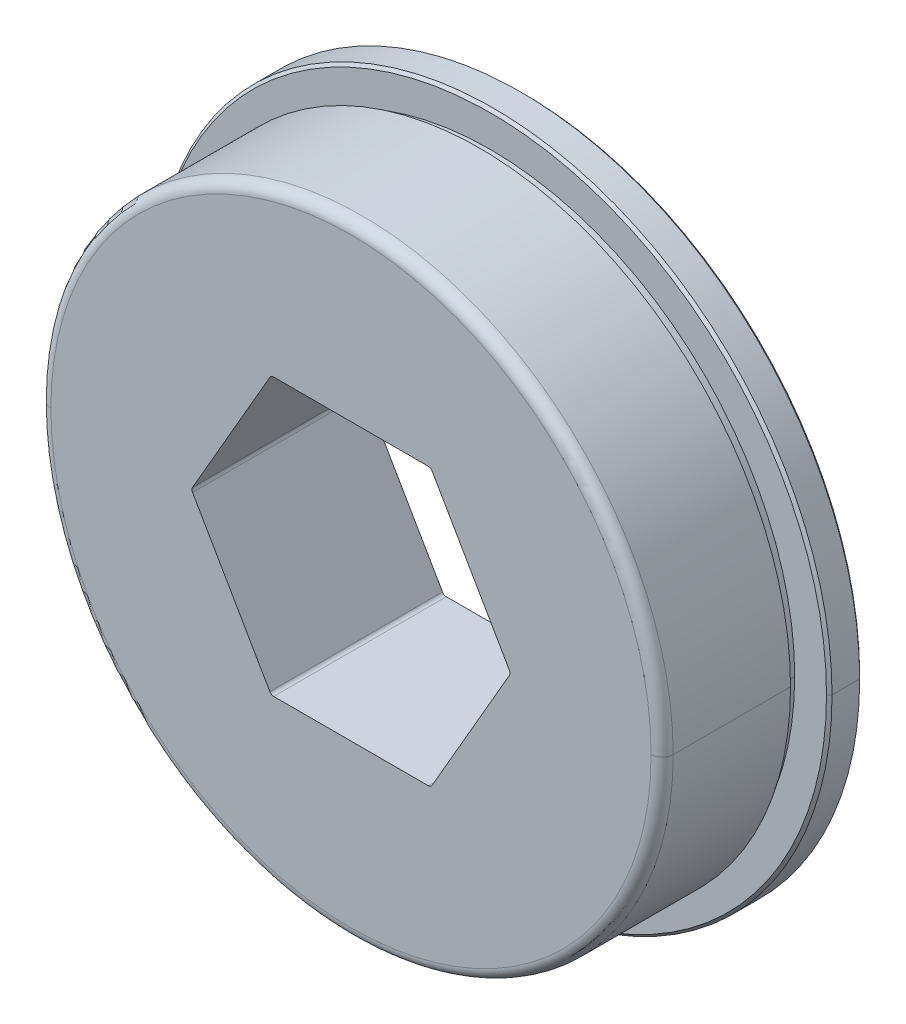
ISO-10303-21;
HEADER;
FILE_DESCRIPTION(('STEP AP214'),'2;1');
FILE_NAME('part.step','',(''),(''),'','','');
FILE_SCHEMA(('AUTOMOTIVE_DESIGN { 1 0 10303 214 1 1 1 1 }'));
ENDSEC;
DATA;
#1=APPLICATION_CONTEXT('core data for automotive mechanical design processes');
#2=APPLICATION_PROTOCOL_DEFINITION('international standard','automotive_design',2000,#1);
#3=PRODUCT_CONTEXT('',#1,'mechanical');
#4=PRODUCT('Part','Part','',(#3));
#5=PRODUCT_RELATED_PRODUCT_CATEGORY('part','',(#4));
#6=PRODUCT_DEFINITION_FORMATION('','',#4);
#7=PRODUCT_DEFINITION_CONTEXT('part definition',#1,'design');
#8=PRODUCT_DEFINITION('design','',#6,#7);
#9=PRODUCT_DEFINITION_SHAPE('','',#8);
#10=(LENGTH_UNIT() NAMED_UNIT(*) SI_UNIT(.MILLI.,.METRE.));
#11=(NAMED_UNIT(*) PLANE_ANGLE_UNIT() SI_UNIT($,.RADIAN.));
#12=(NAMED_UNIT(*) SI_UNIT($,.STERADIAN.) SOLID_ANGLE_UNIT());
#13=UNCERTAINTY_MEASURE_WITH_UNIT(LENGTH_MEASURE(1.E-05),#10,'distance_accuracy_value','');
#14=(GEOMETRIC_REPRESENTATION_CONTEXT(3) GLOBAL_UNCERTAINTY_ASSIGNED_CONTEXT((#13)) GLOBAL_UNIT_ASSIGNED_CONTEXT((#10,
#11,#12)) REPRESENTATION_CONTEXT('',''));
#15=CARTESIAN_POINT('',(0.,0.,0.));
#16=DIRECTION('',(0.,0.,1.));
#17=DIRECTION('',(1.,0.,0.));
#18=AXIS2_PLACEMENT_3D('',#15,#16,#17);
#19=CARTESIAN_POINT('',(-3.54885663465478,6.1468,-7.92734));
#20=DIRECTION('',(0.,0.,-1.));
#21=DIRECTION('',(1.,0.,0.));
#22=AXIS2_PLACEMENT_3D('',#19,#20,#21);
#23=CYLINDRICAL_SURFACE('',#22,0.2032);
#24=CARTESIAN_POINT('',(-3.54885663465478,6.1468,-7.92734));
#25=DIRECTION('',(0.,0.,-1.));
#26=DIRECTION('',(1.,0.,0.));
#27=AXIS2_PLACEMENT_3D('',#24,#25,#26);
#28=CIRCLE('',#27,0.2032);
#29=CARTESIAN_POINT('',(-3.72483299670378,6.2484,-7.92734));
#30=VERTEX_POINT('',#29);
#31=CARTESIAN_POINT('',(-3.54885663465478,6.35,-7.92734));
#32=VERTEX_POINT('',#31);
#33=EDGE_CURVE('E282',#30,#32,#28,.T.);
#34=ORIENTED_EDGE('',*,*,#33,.T.);
#35=DIRECTION('',(0.,0.,1.));
#36=VECTOR('',#35,1.);
#37=CARTESIAN_POINT('',(-3.54885663465478,6.35,0.));
#38=LINE('',#37,#36);
#39=CARTESIAN_POINT('',(-3.54885663465478,6.35,0.));
#40=VERTEX_POINT('',#39);
#41=EDGE_CURVE('E11',#32,#40,#38,.T.);
#42=ORIENTED_EDGE('',*,*,#41,.T.);
#43=CARTESIAN_POINT('',(-3.54885663465478,6.1468,0.));
#44=DIRECTION('',(0.,0.,1.));
#45=DIRECTION('',(-1.,0.,0.));
#46=AXIS2_PLACEMENT_3D('',#43,#44,#45);
#47=CIRCLE('',#46,0.2032);
#48=CARTESIAN_POINT('',(-3.72483299670378,6.2484,0.));
#49=VERTEX_POINT('',#48);
#50=EDGE_CURVE('E257',#40,#49,#47,.T.);
#51=ORIENTED_EDGE('',*,*,#50,.T.);
#52=DIRECTION('',(0.,0.,-1.));
#53=VECTOR('',#52,1.);
#54=CARTESIAN_POINT('',(-3.72483299670378,6.2484,-7.92734));
#55=LINE('',#54,#53);
#56=EDGE_CURVE('E407',#49,#30,#55,.T.);
#57=ORIENTED_EDGE('',*,*,#56,.T.);
#58=EDGE_LOOP('',(#34,#42,#51,#57));
#59=FACE_BOUND('',#58,.T.);
#60=ADVANCED_FACE('F46',(#59),#23,.F.);
#61=CARTESIAN_POINT('',(-7.09771326930958,0.,-7.92734));
#62=DIRECTION('',(0.,0.,-1.));
#63=DIRECTION('',(1.,0.,0.));
#64=AXIS2_PLACEMENT_3D('',#61,#62,#63);
#65=CYLINDRICAL_SURFACE('',#64,0.2032);
#66=CARTESIAN_POINT('',(-7.09771326930958,0.,-7.92734));
#67=DIRECTION('',(0.,0.,-1.));
#68=DIRECTION('',(1.,0.,0.));
#69=AXIS2_PLACEMENT_3D('',#66,#67,#68);
#70=CIRCLE('',#69,0.2032);
#71=CARTESIAN_POINT('',(-7.27368963135857,-0.101600000000006,-7.92734));
#72=VERTEX_POINT('',#71);
#73=CARTESIAN_POINT('',(-7.27368963135857,0.101599999999993,-7.92734));
#74=VERTEX_POINT('',#73);
#75=EDGE_CURVE('E283',#72,#74,#70,.T.);
#76=ORIENTED_EDGE('',*,*,#75,.T.);
#77=DIRECTION('',(0.,0.,1.));
#78=VECTOR('',#77,1.);
#79=CARTESIAN_POINT('',(-7.27368963135857,0.101599999999994,0.));
#80=LINE('',#79,#78);
#81=CARTESIAN_POINT('',(-7.27368963135857,0.101599999999993,0.));
#82=VERTEX_POINT('',#81);
#83=EDGE_CURVE('E412',#74,#82,#80,.T.);
#84=ORIENTED_EDGE('',*,*,#83,.T.);
#85=CARTESIAN_POINT('',(-7.09771326930958,0.,0.));
#86=DIRECTION('',(0.,0.,1.));
#87=DIRECTION('',(-1.,0.,0.));
#88=AXIS2_PLACEMENT_3D('',#85,#86,#87);
#89=CIRCLE('',#88,0.2032);
#90=CARTESIAN_POINT('',(-7.27368963135857,-0.101600000000006,0.));
#91=VERTEX_POINT('',#90);
#92=EDGE_CURVE('E287',#82,#91,#89,.T.);
#93=ORIENTED_EDGE('',*,*,#92,.T.);
#94=DIRECTION('',(0.,0.,-1.));
#95=VECTOR('',#94,1.);
#96=CARTESIAN_POINT('',(-7.27368963135857,-0.101600000000006,-7.92734));
#97=LINE('',#96,#95);
#98=EDGE_CURVE('E457',#91,#72,#97,.T.);
#99=ORIENTED_EDGE('',*,*,#98,.T.);
#100=EDGE_LOOP('',(#76,#84,#93,#99));
#101=FACE_BOUND('',#100,.T.);
#102=ADVANCED_FACE('F511',(#101),#65,.F.);
#103=CARTESIAN_POINT('',(-3.54885663465478,-6.1468,-7.92734));
#104=DIRECTION('',(0.,0.,-1.));
#105=DIRECTION('',(1.,0.,0.));
#106=AXIS2_PLACEMENT_3D('',#103,#104,#105);
#107=CYLINDRICAL_SURFACE('',#106,0.2032);
#108=CARTESIAN_POINT('',(-3.54885663465478,-6.1468,-7.92734));
#109=DIRECTION('',(0.,0.,-1.));
#110=DIRECTION('',(1.,0.,0.));
#111=AXIS2_PLACEMENT_3D('',#108,#109,#110);
#112=CIRCLE('',#111,0.2032);
#113=CARTESIAN_POINT('',(-3.54885663465478,-6.35,-7.92734));
#114=VERTEX_POINT('',#113);
#115=CARTESIAN_POINT('',(-3.72483299670378,-6.2484,-7.92734));
#116=VERTEX_POINT('',#115);
#117=EDGE_CURVE('E361',#114,#116,#112,.T.);
#118=ORIENTED_EDGE('',*,*,#117,.T.);
#119=DIRECTION('',(0.,0.,1.));
#120=VECTOR('',#119,1.);
#121=CARTESIAN_POINT('',(-3.72483299670378,-6.2484,0.));
#122=LINE('',#121,#120);
#123=CARTESIAN_POINT('',(-3.72483299670378,-6.2484,0.));
#124=VERTEX_POINT('',#123);
#125=EDGE_CURVE('E411',#116,#124,#122,.T.);
#126=ORIENTED_EDGE('',*,*,#125,.T.);
#127=CARTESIAN_POINT('',(-3.54885663465478,-6.1468,0.));
#128=DIRECTION('',(0.,0.,1.));
#129=DIRECTION('',(-1.,0.,0.));
#130=AXIS2_PLACEMENT_3D('',#127,#128,#129);
#131=CIRCLE('',#130,0.2032);
#132=CARTESIAN_POINT('',(-3.54885663465478,-6.35,0.));
#133=VERTEX_POINT('',#132);
#134=EDGE_CURVE('E272',#124,#133,#131,.T.);
#135=ORIENTED_EDGE('',*,*,#134,.T.);
#136=DIRECTION('',(0.,0.,-1.));
#137=VECTOR('',#136,1.);
#138=CARTESIAN_POINT('',(-3.54885663465478,-6.35,-7.92734));
#139=LINE('',#138,#137);
#140=EDGE_CURVE('E312',#133,#114,#139,.T.);
#141=ORIENTED_EDGE('',*,*,#140,.T.);
#142=EDGE_LOOP('',(#118,#126,#135,#141));
#143=FACE_BOUND('',#142,.T.);
#144=ADVANCED_FACE('F517',(#143),#107,.F.);
#145=CARTESIAN_POINT('',(3.5488566346548,-6.1468,-7.92734));
#146=DIRECTION('',(0.,0.,-1.));
#147=DIRECTION('',(1.,0.,0.));
#148=AXIS2_PLACEMENT_3D('',#145,#146,#147);
#149=CYLINDRICAL_SURFACE('',#148,0.2032);
#150=CARTESIAN_POINT('',(3.5488566346548,-6.1468,-7.92734));
#151=DIRECTION('',(0.,0.,-1.));
#152=DIRECTION('',(1.,0.,0.));
#153=AXIS2_PLACEMENT_3D('',#150,#151,#152);
#154=CIRCLE('',#153,0.2032);
#155=CARTESIAN_POINT('',(3.7248329967038,-6.2484,-7.92734));
#156=VERTEX_POINT('',#155);
#157=CARTESIAN_POINT('',(3.5488566346548,-6.35,-7.92734));
#158=VERTEX_POINT('',#157);
#159=EDGE_CURVE('E50',#156,#158,#154,.T.);
#160=ORIENTED_EDGE('',*,*,#159,.T.);
#161=DIRECTION('',(0.,0.,1.));
#162=VECTOR('',#161,1.);
#163=CARTESIAN_POINT('',(3.5488566346548,-6.35,0.));
#164=LINE('',#163,#162);
#165=CARTESIAN_POINT('',(3.5488566346548,-6.35,0.));
#166=VERTEX_POINT('',#165);
#167=EDGE_CURVE('E453',#158,#166,#164,.T.);
#168=ORIENTED_EDGE('',*,*,#167,.T.);
#169=CARTESIAN_POINT('',(3.5488566346548,-6.1468,0.));
#170=DIRECTION('',(0.,0.,1.));
#171=DIRECTION('',(-1.,0.,0.));
#172=AXIS2_PLACEMENT_3D('',#169,#170,#171);
#173=CIRCLE('',#172,0.2032);
#174=CARTESIAN_POINT('',(3.7248329967038,-6.2484,0.));
#175=VERTEX_POINT('',#174);
#176=EDGE_CURVE('E390',#166,#175,#173,.T.);
#177=ORIENTED_EDGE('',*,*,#176,.T.);
#178=DIRECTION('',(0.,0.,-1.));
#179=VECTOR('',#178,1.);
#180=CARTESIAN_POINT('',(3.7248329967038,-6.2484,-7.92734));
#181=LINE('',#180,#179);
#182=EDGE_CURVE('E311',#175,#156,#181,.T.);
#183=ORIENTED_EDGE('',*,*,#182,.T.);
#184=EDGE_LOOP('',(#160,#168,#177,#183));
#185=FACE_BOUND('',#184,.T.);
#186=ADVANCED_FACE('F548',(#185),#149,.F.);
#187=CARTESIAN_POINT('',(7.09771326930959,0.,-7.92734));
#188=DIRECTION('',(0.,0.,-1.));
#189=DIRECTION('',(1.,0.,0.));
#190=AXIS2_PLACEMENT_3D('',#187,#188,#189);
#191=CYLINDRICAL_SURFACE('',#190,0.2032);
#192=DIRECTION('',(0.,0.,-1.));
#193=VECTOR('',#192,1.);
#194=CARTESIAN_POINT('',(7.30091326930959,0.,-7.92734));
#195=LINE('',#194,#193);
#196=CARTESIAN_POINT('',(7.30091326930959,0.,0.));
#197=VERTEX_POINT('',#196);
#198=CARTESIAN_POINT('',(7.30091326930959,0.,-7.92734));
#199=VERTEX_POINT('',#198);
#200=EDGE_CURVE('E366',#197,#199,#195,.T.);
#201=ORIENTED_EDGE('',*,*,#200,.T.);
#202=CARTESIAN_POINT('',(7.09771326930959,0.,-7.92734));
#203=DIRECTION('',(0.,0.,-1.));
#204=DIRECTION('',(1.,0.,0.));
#205=AXIS2_PLACEMENT_3D('',#202,#203,#204);
#206=CIRCLE('',#205,0.2032);
#207=CARTESIAN_POINT('',(7.27368963135859,-0.101600000000005,-7.92734));
#208=VERTEX_POINT('',#207);
#209=EDGE_CURVE('E397',#199,#208,#206,.T.);
#210=ORIENTED_EDGE('',*,*,#209,.T.);
#211=DIRECTION('',(0.,0.,1.));
#212=VECTOR('',#211,1.);
#213=CARTESIAN_POINT('',(7.27368963135859,-0.101600000000005,0.));
#214=LINE('',#213,#212);
#215=CARTESIAN_POINT('',(7.27368963135859,-0.101600000000005,0.));
#216=VERTEX_POINT('',#215);
#217=EDGE_CURVE('E307',#208,#216,#214,.T.);
#218=ORIENTED_EDGE('',*,*,#217,.T.);
#219=CARTESIAN_POINT('',(7.09771326930959,0.,0.));
#220=DIRECTION('',(0.,0.,1.));
#221=DIRECTION('',(-1.,0.,0.));
#222=AXIS2_PLACEMENT_3D('',#219,#220,#221);
#223=CIRCLE('',#222,0.2032);
#224=EDGE_CURVE('E299',#216,#197,#223,.T.);
#225=ORIENTED_EDGE('',*,*,#224,.T.);
#226=EDGE_LOOP('',(#201,#210,#218,#225));
#227=FACE_BOUND('',#226,.T.);
#228=ADVANCED_FACE('F774',(#227),#191,.F.);
#229=CARTESIAN_POINT('',(3.5488566346548,6.1468,-7.92734));
#230=DIRECTION('',(0.,0.,-1.));
#231=DIRECTION('',(1.,0.,0.));
#232=AXIS2_PLACEMENT_3D('',#229,#230,#231);
#233=CYLINDRICAL_SURFACE('',#232,0.2032);
#234=CARTESIAN_POINT('',(3.5488566346548,6.1468,-7.92734));
#235=DIRECTION('',(0.,0.,-1.));
#236=DIRECTION('',(1.,0.,0.));
#237=AXIS2_PLACEMENT_3D('',#234,#235,#236);
#238=CIRCLE('',#237,0.2032);
#239=CARTESIAN_POINT('',(3.5488566346548,6.35,-7.92734));
#240=VERTEX_POINT('',#239);
#241=CARTESIAN_POINT('',(3.7248329967038,6.2484,-7.92734));
#242=VERTEX_POINT('',#241);
#243=EDGE_CURVE('E352',#240,#242,#238,.T.);
#244=ORIENTED_EDGE('',*,*,#243,.T.);
#245=DIRECTION('',(0.,0.,1.));
#246=VECTOR('',#245,1.);
#247=CARTESIAN_POINT('',(3.7248329967038,6.2484,0.));
#248=LINE('',#247,#246);
#249=CARTESIAN_POINT('',(3.7248329967038,6.2484,0.));
#250=VERTEX_POINT('',#249);
#251=EDGE_CURVE('E450',#242,#250,#248,.T.);
#252=ORIENTED_EDGE('',*,*,#251,.T.);
#253=CARTESIAN_POINT('',(3.5488566346548,6.1468,0.));
#254=DIRECTION('',(0.,0.,1.));
#255=DIRECTION('',(-1.,0.,0.));
#256=AXIS2_PLACEMENT_3D('',#253,#254,#255);
#257=CIRCLE('',#256,0.2032);
#258=CARTESIAN_POINT('',(3.5488566346548,6.35,0.));
#259=VERTEX_POINT('',#258);
#260=EDGE_CURVE('E288',#250,#259,#257,.T.);
#261=ORIENTED_EDGE('',*,*,#260,.T.);
#262=DIRECTION('',(0.,0.,-1.));
#263=VECTOR('',#262,1.);
#264=CARTESIAN_POINT('',(3.5488566346548,6.35,-7.92734));
#265=LINE('',#264,#263);
#266=EDGE_CURVE('E57',#259,#240,#265,.T.);
#267=ORIENTED_EDGE('',*,*,#266,.T.);
#268=EDGE_LOOP('',(#244,#252,#261,#267));
#269=FACE_BOUND('',#268,.T.);
#270=ADVANCED_FACE('F611',(#269),#233,.F.);
#271=CARTESIAN_POINT('',(0.,0.,-0.508));
#272=DIRECTION('',(0.,0.,1.));
#273=DIRECTION('',(-1.,0.,0.));
#274=AXIS2_PLACEMENT_3D('',#271,#272,#273);
#275=TOROIDAL_SURFACE('',#274,13.7795,0.508);
#276=CARTESIAN_POINT('',(13.7795,0.,-0.508));
#277=DIRECTION('',(0.,-1.,0.));
#278=DIRECTION('',(-1.,0.,0.));
#279=AXIS2_PLACEMENT_3D('',#276,#277,#278);
#280=CIRCLE('',#279,0.508);
#281=CARTESIAN_POINT('',(14.2875,0.,-0.508));
#282=VERTEX_POINT('',#281);
#283=CARTESIAN_POINT('',(13.7795,0.,0.));
#284=VERTEX_POINT('',#283);
#285=EDGE_CURVE('E387',#282,#284,#280,.T.);
#286=ORIENTED_EDGE('',*,*,#285,.T.);
#287=CARTESIAN_POINT('',(0.,0.,0.));
#288=DIRECTION('',(0.,0.,-1.));
#289=DIRECTION('',(-1.,0.,0.));
#290=AXIS2_PLACEMENT_3D('',#287,#288,#289);
#291=CIRCLE('',#290,13.7795);
#292=CARTESIAN_POINT('',(-13.7795,0.,0.));
#293=VERTEX_POINT('',#292);
#294=EDGE_CURVE('E425',#284,#293,#291,.T.);
#295=ORIENTED_EDGE('',*,*,#294,.T.);
#296=CARTESIAN_POINT('',(-13.7795,0.,-0.508));
#297=DIRECTION('',(0.,1.,0.));
#298=DIRECTION('',(0.,0.,1.));
#299=AXIS2_PLACEMENT_3D('',#296,#297,#298);
#300=CIRCLE('',#299,0.508);
#301=CARTESIAN_POINT('',(-14.2875,0.,-0.508));
#302=VERTEX_POINT('',#301);
#303=EDGE_CURVE('E293',#302,#293,#300,.T.);
#304=ORIENTED_EDGE('',*,*,#303,.F.);
#305=CARTESIAN_POINT('',(0.,0.,-0.508));
#306=DIRECTION('',(0.,0.,1.));
#307=DIRECTION('',(-1.,0.,0.));
#308=AXIS2_PLACEMENT_3D('',#305,#306,#307);
#309=CIRCLE('',#308,14.2875);
#310=EDGE_CURVE('E256',#302,#282,#309,.T.);
#311=ORIENTED_EDGE('',*,*,#310,.T.);
#312=EDGE_LOOP('',(#286,#295,#304,#311));
#313=FACE_BOUND('',#312,.T.);
#314=ADVANCED_FACE('F492',(#313),#275,.T.);
#315=CARTESIAN_POINT('',(0.,0.,-7.80034));
#316=DIRECTION('',(0.,0.,1.));
#317=DIRECTION('',(-1.,0.,0.));
#318=AXIS2_PLACEMENT_3D('',#315,#316,#317);
#319=CONICAL_SURFACE('',#318,15.5575,0.785398163397442);
#320=DIRECTION('',(0.707106781186543,0.,0.707106781186552));
#321=VECTOR('',#320,1.);
#322=CARTESIAN_POINT('',(15.5575,0.,-7.80034));
#323=LINE('',#322,#321);
#324=CARTESIAN_POINT('',(15.4305,0.,-7.92734));
#325=VERTEX_POINT('',#324);
#326=CARTESIAN_POINT('',(15.5575,0.,-7.80034));
#327=VERTEX_POINT('',#326);
#328=EDGE_CURVE('E371',#325,#327,#323,.T.);
#329=ORIENTED_EDGE('',*,*,#328,.T.);
#330=CARTESIAN_POINT('',(0.,0.,-7.80034));
#331=DIRECTION('',(0.,0.,-1.));
#332=DIRECTION('',(1.,0.,0.));
#333=AXIS2_PLACEMENT_3D('',#330,#331,#332);
#334=CIRCLE('',#333,15.5575);
#335=CARTESIAN_POINT('',(-15.5575,0.,-7.80034));
#336=VERTEX_POINT('',#335);
#337=EDGE_CURVE('E348',#327,#336,#334,.T.);
#338=ORIENTED_EDGE('',*,*,#337,.T.);
#339=DIRECTION('',(-0.707106781186543,0.,0.707106781186552));
#340=VECTOR('',#339,1.);
#341=CARTESIAN_POINT('',(-15.5575,0.,-7.80034));
#342=LINE('',#341,#340);
#343=CARTESIAN_POINT('',(-15.4305,0.,-7.92734));
#344=VERTEX_POINT('',#343);
#345=EDGE_CURVE('E370',#344,#336,#342,.T.);
#346=ORIENTED_EDGE('',*,*,#345,.F.);
#347=CARTESIAN_POINT('',(0.,0.,-7.92734));
#348=DIRECTION('',(0.,0.,1.));
#349=DIRECTION('',(1.,0.,0.));
#350=AXIS2_PLACEMENT_3D('',#347,#348,#349);
#351=CIRCLE('',#350,15.4305);
#352=EDGE_CURVE('E323',#344,#325,#351,.T.);
#353=ORIENTED_EDGE('',*,*,#352,.T.);
#354=EDGE_LOOP('',(#329,#338,#346,#353));
#355=FACE_BOUND('',#354,.T.);
#356=ADVANCED_FACE('F580',(#355),#319,.T.);
#357=CARTESIAN_POINT('',(0.,0.,-6.40334));
#358=DIRECTION('',(0.,0.,-1.));
#359=DIRECTION('',(1.,0.,0.));
#360=AXIS2_PLACEMENT_3D('',#357,#358,#359);
#361=CONICAL_SURFACE('',#360,15.4305,0.785398163397469);
#362=DIRECTION('',(-0.707106781186562,0.,-0.707106781186533));
#363=VECTOR('',#362,1.);
#364=CARTESIAN_POINT('',(-15.4305,0.,-6.40334));
#365=LINE('',#364,#363);
#366=CARTESIAN_POINT('',(-15.4305,0.,-6.40334));
#367=VERTEX_POINT('',#366);
#368=CARTESIAN_POINT('',(-15.5575,0.,-6.53034));
#369=VERTEX_POINT('',#368);
#370=EDGE_CURVE('E316',#367,#369,#365,.T.);
#371=ORIENTED_EDGE('',*,*,#370,.T.);
#372=CARTESIAN_POINT('',(0.,0.,-6.53034));
#373=DIRECTION('',(0.,0.,1.));
#374=DIRECTION('',(-1.,0.,0.));
#375=AXIS2_PLACEMENT_3D('',#372,#373,#374);
#376=CIRCLE('',#375,15.5575);
#377=CARTESIAN_POINT('',(15.5575,0.,-6.53034));
#378=VERTEX_POINT('',#377);
#379=EDGE_CURVE('E336',#369,#378,#376,.T.);
#380=ORIENTED_EDGE('',*,*,#379,.T.);
#381=DIRECTION('',(0.707106781186562,0.,-0.707106781186533));
#382=VECTOR('',#381,1.);
#383=CARTESIAN_POINT('',(15.4305,0.,-6.40334));
#384=LINE('',#383,#382);
#385=CARTESIAN_POINT('',(15.4305,0.,-6.40334));
#386=VERTEX_POINT('',#385);
#387=EDGE_CURVE('E379',#386,#378,#384,.T.);
#388=ORIENTED_EDGE('',*,*,#387,.F.);
#389=CARTESIAN_POINT('',(0.,0.,-6.40334));
#390=DIRECTION('',(0.,0.,-1.));
#391=DIRECTION('',(-1.,0.,0.));
#392=AXIS2_PLACEMENT_3D('',#389,#390,#391);
#393=CIRCLE('',#392,15.4305);
#394=EDGE_CURVE('E439',#386,#367,#393,.T.);
#395=ORIENTED_EDGE('',*,*,#394,.T.);
#396=EDGE_LOOP('',(#371,#380,#388,#395));
#397=FACE_BOUND('',#396,.T.);
#398=ADVANCED_FACE('F563',(#397),#361,.T.);
#399=CARTESIAN_POINT('',(-3.66617420935412,6.35,-7.92734));
#400=DIRECTION('',(0.,1.,0.));
#401=DIRECTION('',(1.,0.,0.));
#402=AXIS2_PLACEMENT_3D('',#399,#400,#401);
#403=PLANE('',#402);
#404=DIRECTION('',(1.,0.,0.));
#405=VECTOR('',#404,1.);
#406=CARTESIAN_POINT('',(-3.66617420935412,6.35,0.));
#407=LINE('',#406,#405);
#408=EDGE_CURVE('E70',#40,#259,#407,.T.);
#409=ORIENTED_EDGE('',*,*,#408,.F.);
#410=ORIENTED_EDGE('',*,*,#41,.F.);
#411=DIRECTION('',(1.,0.,0.));
#412=VECTOR('',#411,1.);
#413=CARTESIAN_POINT('',(-3.66617420935412,6.35,-7.92734));
#414=LINE('',#413,#412);
#415=EDGE_CURVE('E357',#32,#240,#414,.T.);
#416=ORIENTED_EDGE('',*,*,#415,.T.);
#417=ORIENTED_EDGE('',*,*,#266,.F.);
#418=EDGE_LOOP('',(#409,#410,#416,#417));
#419=FACE_BOUND('',#418,.T.);
#420=ADVANCED_FACE('F526',(#419),#403,.F.);
#421=CARTESIAN_POINT('',(3.66617420935413,6.35,-7.92734));
#422=DIRECTION('',(0.866025403784439,0.5,0.));
#423=DIRECTION('',(0.,0.,1.));
#424=AXIS2_PLACEMENT_3D('',#421,#422,#423);
#425=PLANE('',#424);
#426=DIRECTION('',(0.5,-0.866025403784439,0.));
#427=VECTOR('',#426,1.);
#428=CARTESIAN_POINT('',(3.66617420935413,6.35,-7.92734));
#429=LINE('',#428,#427);
#430=CARTESIAN_POINT('',(7.27368963135859,0.101599999999997,-7.92734));
#431=VERTEX_POINT('',#430);
#432=EDGE_CURVE('E356',#242,#431,#429,.T.);
#433=ORIENTED_EDGE('',*,*,#432,.T.);
#434=DIRECTION('',(0.,0.,-1.));
#435=VECTOR('',#434,1.);
#436=CARTESIAN_POINT('',(7.27368963135859,0.101599999999995,-7.92734));
#437=LINE('',#436,#435);
#438=CARTESIAN_POINT('',(7.27368963135859,0.101599999999997,0.));
#439=VERTEX_POINT('',#438);
#440=EDGE_CURVE('E365',#439,#431,#437,.T.);
#441=ORIENTED_EDGE('',*,*,#440,.F.);
#442=DIRECTION('',(0.5,-0.866025403784439,0.));
#443=VECTOR('',#442,1.);
#444=CARTESIAN_POINT('',(3.66617420935413,6.35,0.));
#445=LINE('',#444,#443);
#446=EDGE_CURVE('E292',#250,#439,#445,.T.);
#447=ORIENTED_EDGE('',*,*,#446,.F.);
#448=ORIENTED_EDGE('',*,*,#251,.F.);
#449=EDGE_LOOP('',(#433,#441,#447,#448));
#450=FACE_BOUND('',#449,.T.);
#451=ADVANCED_FACE('F524',(#450),#425,.F.);
#452=CARTESIAN_POINT('',(7.33234841870826,0.,-7.92734));
#453=DIRECTION('',(0.866025403784439,-0.5,0.));
#454=DIRECTION('',(0.,0.,1.));
#455=AXIS2_PLACEMENT_3D('',#452,#453,#454);
#456=PLANE('',#455);
#457=DIRECTION('',(-0.5,-0.866025403784439,0.));
#458=VECTOR('',#457,1.);
#459=CARTESIAN_POINT('',(7.33234841870826,0.,-7.92734));
#460=LINE('',#459,#458);
#461=EDGE_CURVE('E400',#208,#156,#460,.T.);
#462=ORIENTED_EDGE('',*,*,#461,.T.);
#463=ORIENTED_EDGE('',*,*,#182,.F.);
#464=DIRECTION('',(-0.5,-0.866025403784439,0.));
#465=VECTOR('',#464,1.);
#466=CARTESIAN_POINT('',(7.33234841870826,0.,0.));
#467=LINE('',#466,#465);
#468=EDGE_CURVE('E303',#216,#175,#467,.T.);
#469=ORIENTED_EDGE('',*,*,#468,.F.);
#470=ORIENTED_EDGE('',*,*,#217,.F.);
#471=EDGE_LOOP('',(#462,#463,#469,#470));
#472=FACE_BOUND('',#471,.T.);
#473=ADVANCED_FACE('F48',(#472),#456,.F.);
#474=CARTESIAN_POINT('',(3.66617420935413,-6.35,-7.92734));
#475=DIRECTION('',(0.,-1.,0.));
#476=DIRECTION('',(0.,0.,1.));
#477=AXIS2_PLACEMENT_3D('',#474,#475,#476);
#478=PLANE('',#477);
#479=DIRECTION('',(-1.,0.,0.));
#480=VECTOR('',#479,1.);
#481=CARTESIAN_POINT('',(3.66617420935413,-6.35,-7.92734));
#482=LINE('',#481,#480);
#483=EDGE_CURVE('E358',#158,#114,#482,.T.);
#484=ORIENTED_EDGE('',*,*,#483,.T.);
#485=ORIENTED_EDGE('',*,*,#140,.F.);
#486=DIRECTION('',(-1.,0.,0.));
#487=VECTOR('',#486,1.);
#488=CARTESIAN_POINT('',(3.66617420935413,-6.35,0.));
#489=LINE('',#488,#487);
#490=EDGE_CURVE('E472',#166,#133,#489,.T.);
#491=ORIENTED_EDGE('',*,*,#490,.F.);
#492=ORIENTED_EDGE('',*,*,#167,.F.);
#493=EDGE_LOOP('',(#484,#485,#491,#492));
#494=FACE_BOUND('',#493,.T.);
#495=ADVANCED_FACE('F553',(#494),#478,.F.);
#496=CARTESIAN_POINT('',(-3.66617420935412,-6.35,-7.92734));
#497=DIRECTION('',(-0.866025403784439,-0.5,0.));
#498=DIRECTION('',(-0.5,0.866025403784439,0.));
#499=AXIS2_PLACEMENT_3D('',#496,#497,#498);
#500=PLANE('',#499);
#501=DIRECTION('',(-0.5,0.866025403784439,0.));
#502=VECTOR('',#501,1.);
#503=CARTESIAN_POINT('',(-3.66617420935412,-6.35,-7.92734));
#504=LINE('',#503,#502);
#505=EDGE_CURVE('E321',#116,#72,#504,.T.);
#506=ORIENTED_EDGE('',*,*,#505,.T.);
#507=ORIENTED_EDGE('',*,*,#98,.F.);
#508=DIRECTION('',(-0.5,0.866025403784439,0.));
#509=VECTOR('',#508,1.);
#510=CARTESIAN_POINT('',(-3.66617420935412,-6.35,0.));
#511=LINE('',#510,#509);
#512=EDGE_CURVE('E284',#124,#91,#511,.T.);
#513=ORIENTED_EDGE('',*,*,#512,.F.);
#514=ORIENTED_EDGE('',*,*,#125,.F.);
#515=EDGE_LOOP('',(#506,#507,#513,#514));
#516=FACE_BOUND('',#515,.T.);
#517=ADVANCED_FACE('F555',(#516),#500,.F.);
#518=CARTESIAN_POINT('',(-7.33234841870824,0.,-7.92734));
#519=DIRECTION('',(-0.866025403784439,0.5,0.));
#520=DIRECTION('',(0.,0.,-1.));
#521=AXIS2_PLACEMENT_3D('',#518,#519,#520);
#522=PLANE('',#521);
#523=DIRECTION('',(0.5,0.866025403784439,0.));
#524=VECTOR('',#523,1.);
#525=CARTESIAN_POINT('',(-7.33234841870824,0.,-7.92734));
#526=LINE('',#525,#524);
#527=EDGE_CURVE('E279',#74,#30,#526,.T.);
#528=ORIENTED_EDGE('',*,*,#527,.T.);
#529=ORIENTED_EDGE('',*,*,#56,.F.);
#530=DIRECTION('',(0.5,0.866025403784439,0.));
#531=VECTOR('',#530,1.);
#532=CARTESIAN_POINT('',(-7.33234841870824,0.,0.));
#533=LINE('',#532,#531);
#534=EDGE_CURVE('E433',#82,#49,#533,.T.);
#535=ORIENTED_EDGE('',*,*,#534,.F.);
#536=ORIENTED_EDGE('',*,*,#83,.F.);
#537=EDGE_LOOP('',(#528,#529,#535,#536));
#538=FACE_BOUND('',#537,.T.);
#539=ADVANCED_FACE('F559',(#538),#522,.F.);
#540=CARTESIAN_POINT('',(13.97,0.,-6.40334));
#541=DIRECTION('',(0.,0.,1.));
#542=DIRECTION('',(0.,-1.,0.));
#543=AXIS2_PLACEMENT_3D('',#540,#541,#542);
#544=PLANE('',#543);
#545=CARTESIAN_POINT('',(0.,0.,-6.40334));
#546=DIRECTION('',(0.,0.,-1.));
#547=DIRECTION('',(-1.,0.,0.));
#548=AXIS2_PLACEMENT_3D('',#545,#546,#547);
#549=CIRCLE('',#548,13.97);
#550=CARTESIAN_POINT('',(-13.97,0.,-6.40334));
#551=VERTEX_POINT('',#550);
#552=CARTESIAN_POINT('',(13.97,0.,-6.40334));
#553=VERTEX_POINT('',#552);
#554=EDGE_CURVE('E278',#551,#553,#549,.T.);
#555=ORIENTED_EDGE('',*,*,#554,.T.);
#556=CARTESIAN_POINT('',(0.,0.,-6.40334));
#557=DIRECTION('',(0.,0.,-1.));
#558=DIRECTION('',(-1.,0.,0.));
#559=AXIS2_PLACEMENT_3D('',#556,#557,#558);
#560=CIRCLE('',#559,13.97);
#561=EDGE_CURVE('E384',#553,#551,#560,.T.);
#562=ORIENTED_EDGE('',*,*,#561,.T.);
#563=EDGE_LOOP('',(#555,#562));
#564=FACE_BOUND('',#563,.T.);
#565=ORIENTED_EDGE('',*,*,#394,.F.);
#566=CARTESIAN_POINT('',(0.,0.,-6.40334));
#567=DIRECTION('',(0.,0.,-1.));
#568=DIRECTION('',(-1.,0.,0.));
#569=AXIS2_PLACEMENT_3D('',#566,#567,#568);
#570=CIRCLE('',#569,15.4305);
#571=EDGE_CURVE('E320',#367,#386,#570,.T.);
#572=ORIENTED_EDGE('',*,*,#571,.F.);
#573=EDGE_LOOP('',(#565,#572));
#574=FACE_BOUND('',#573,.T.);
#575=ADVANCED_FACE('F569',(#564,#574),#544,.T.);
#576=CARTESIAN_POINT('',(0.,0.,-7.92734));
#577=DIRECTION('',(0.,0.,1.));
#578=DIRECTION('',(-1.,0.,0.));
#579=AXIS2_PLACEMENT_3D('',#576,#577,#578);
#580=CYLINDRICAL_SURFACE('',#579,13.97);
#581=DIRECTION('',(0.,0.,1.));
#582=VECTOR('',#581,1.);
#583=CARTESIAN_POINT('',(13.97,0.,-7.92734));
#584=LINE('',#583,#582);
#585=CARTESIAN_POINT('',(13.97,0.,-5.89534));
#586=VERTEX_POINT('',#585);
#587=EDGE_CURVE('E274',#553,#586,#584,.T.);
#588=ORIENTED_EDGE('',*,*,#587,.T.);
#589=CARTESIAN_POINT('',(0.,0.,-5.89534));
#590=DIRECTION('',(0.,0.,-1.));
#591=DIRECTION('',(-1.,0.,0.));
#592=AXIS2_PLACEMENT_3D('',#589,#590,#591);
#593=CIRCLE('',#592,13.97);
#594=CARTESIAN_POINT('',(-13.97,0.,-5.89534));
#595=VERTEX_POINT('',#594);
#596=EDGE_CURVE('E380',#586,#595,#593,.T.);
#597=ORIENTED_EDGE('',*,*,#596,.T.);
#598=DIRECTION('',(0.,0.,1.));
#599=VECTOR('',#598,1.);
#600=CARTESIAN_POINT('',(-13.97,0.,-7.92734));
#601=LINE('',#600,#599);
#602=EDGE_CURVE('E261',#551,#595,#601,.T.);
#603=ORIENTED_EDGE('',*,*,#602,.F.);
#604=ORIENTED_EDGE('',*,*,#561,.F.);
#605=EDGE_LOOP('',(#588,#597,#603,#604));
#606=FACE_BOUND('',#605,.T.);
#607=ADVANCED_FACE('F566',(#606),#580,.T.);
#608=CARTESIAN_POINT('',(14.2875,0.,-5.89534));
#609=DIRECTION('',(0.,0.,-1.));
#610=DIRECTION('',(1.,0.,0.));
#611=AXIS2_PLACEMENT_3D('',#608,#609,#610);
#612=PLANE('',#611);
#613=CARTESIAN_POINT('',(0.,0.,-5.89534));
#614=DIRECTION('',(0.,0.,-1.));
#615=DIRECTION('',(-1.,0.,0.));
#616=AXIS2_PLACEMENT_3D('',#613,#614,#615);
#617=CIRCLE('',#616,13.97);
#618=EDGE_CURVE('E268',#595,#586,#617,.T.);
#619=ORIENTED_EDGE('',*,*,#618,.F.);
#620=ORIENTED_EDGE('',*,*,#596,.F.);
#621=EDGE_LOOP('',(#619,#620));
#622=FACE_BOUND('',#621,.T.);
#623=CARTESIAN_POINT('',(0.,0.,-5.89534));
#624=DIRECTION('',(0.,0.,-1.));
#625=DIRECTION('',(-1.,0.,0.));
#626=AXIS2_PLACEMENT_3D('',#623,#624,#625);
#627=CIRCLE('',#626,14.2875);
#628=CARTESIAN_POINT('',(-14.2875,0.,-5.89534));
#629=VERTEX_POINT('',#628);
#630=CARTESIAN_POINT('',(14.2875,0.,-5.89534));
#631=VERTEX_POINT('',#630);
#632=EDGE_CURVE('E243',#629,#631,#627,.T.);
#633=ORIENTED_EDGE('',*,*,#632,.T.);
#634=CARTESIAN_POINT('',(0.,0.,-5.89534));
#635=DIRECTION('',(0.,0.,-1.));
#636=DIRECTION('',(-1.,0.,0.));
#637=AXIS2_PLACEMENT_3D('',#634,#635,#636);
#638=CIRCLE('',#637,14.2875);
#639=EDGE_CURVE('E252',#631,#629,#638,.T.);
#640=ORIENTED_EDGE('',*,*,#639,.T.);
#641=EDGE_LOOP('',(#633,#640));
#642=FACE_BOUND('',#641,.T.);
#643=ADVANCED_FACE('F259',(#622,#642),#612,.T.);
#644=CARTESIAN_POINT('',(0.,0.,-7.92734));
#645=DIRECTION('',(0.,0.,1.));
#646=DIRECTION('',(-1.,0.,0.));
#647=AXIS2_PLACEMENT_3D('',#644,#645,#646);
#648=CYLINDRICAL_SURFACE('',#647,14.2875);
#649=DIRECTION('',(0.,0.,1.));
#650=VECTOR('',#649,1.);
#651=CARTESIAN_POINT('',(14.2875,0.,-7.92734));
#652=LINE('',#651,#650);
#653=EDGE_CURVE('E238',#631,#282,#652,.T.);
#654=ORIENTED_EDGE('',*,*,#653,.T.);
#655=ORIENTED_EDGE('',*,*,#310,.F.);
#656=DIRECTION('',(0.,0.,1.));
#657=VECTOR('',#656,1.);
#658=CARTESIAN_POINT('',(-14.2875,0.,-7.92734));
#659=LINE('',#658,#657);
#660=EDGE_CURVE('E249',#629,#302,#659,.T.);
#661=ORIENTED_EDGE('',*,*,#660,.F.);
#662=ORIENTED_EDGE('',*,*,#639,.F.);
#663=EDGE_LOOP('',(#654,#655,#661,#662));
#664=FACE_BOUND('',#663,.T.);
#665=ADVANCED_FACE('F253',(#664),#648,.T.);
#666=CARTESIAN_POINT('',(0.,0.,0.));
#667=DIRECTION('',(0.,0.,1.));
#668=DIRECTION('',(0.,-1.,0.));
#669=AXIS2_PLACEMENT_3D('',#666,#667,#668);
#670=PLANE('',#669);
#671=ORIENTED_EDGE('',*,*,#534,.T.);
#672=ORIENTED_EDGE('',*,*,#50,.F.);
#673=ORIENTED_EDGE('',*,*,#408,.T.);
#674=ORIENTED_EDGE('',*,*,#260,.F.);
#675=ORIENTED_EDGE('',*,*,#446,.T.);
#676=CARTESIAN_POINT('',(7.09771326930959,0.,0.));
#677=DIRECTION('',(0.,0.,1.));
#678=DIRECTION('',(-1.,0.,0.));
#679=AXIS2_PLACEMENT_3D('',#676,#677,#678);
#680=CIRCLE('',#679,0.2032);
#681=EDGE_CURVE('E416',#197,#439,#680,.T.);
#682=ORIENTED_EDGE('',*,*,#681,.F.);
#683=ORIENTED_EDGE('',*,*,#224,.F.);
#684=ORIENTED_EDGE('',*,*,#468,.T.);
#685=ORIENTED_EDGE('',*,*,#176,.F.);
#686=ORIENTED_EDGE('',*,*,#490,.T.);
#687=ORIENTED_EDGE('',*,*,#134,.F.);
#688=ORIENTED_EDGE('',*,*,#512,.T.);
#689=ORIENTED_EDGE('',*,*,#92,.F.);
#690=EDGE_LOOP('',(#671,#672,#673,#674,#675,#682,#683,#684,#685,#686,#687,#688,#689));
#691=FACE_BOUND('',#690,.T.);
#692=CARTESIAN_POINT('',(0.,0.,0.));
#693=DIRECTION('',(0.,0.,-1.));
#694=DIRECTION('',(-1.,0.,0.));
#695=AXIS2_PLACEMENT_3D('',#692,#693,#694);
#696=CIRCLE('',#695,13.7795);
#697=EDGE_CURVE('E298',#293,#284,#696,.T.);
#698=ORIENTED_EDGE('',*,*,#697,.F.);
#699=ORIENTED_EDGE('',*,*,#294,.F.);
#700=EDGE_LOOP('',(#698,#699));
#701=FACE_BOUND('',#700,.T.);
#702=ADVANCED_FACE('F495',(#691,#701),#670,.T.);
#703=CARTESIAN_POINT('',(15.5575,0.,-7.92734));
#704=DIRECTION('',(0.,0.,-1.));
#705=DIRECTION('',(1.,0.,0.));
#706=AXIS2_PLACEMENT_3D('',#703,#704,#705);
#707=PLANE('',#706);
#708=ORIENTED_EDGE('',*,*,#505,.F.);
#709=ORIENTED_EDGE('',*,*,#117,.F.);
#710=ORIENTED_EDGE('',*,*,#483,.F.);
#711=ORIENTED_EDGE('',*,*,#159,.F.);
#712=ORIENTED_EDGE('',*,*,#461,.F.);
#713=ORIENTED_EDGE('',*,*,#209,.F.);
#714=CARTESIAN_POINT('',(7.09771326930959,0.,-7.92734));
#715=DIRECTION('',(0.,0.,-1.));
#716=DIRECTION('',(1.,0.,0.));
#717=AXIS2_PLACEMENT_3D('',#714,#715,#716);
#718=CIRCLE('',#717,0.2032);
#719=EDGE_CURVE('E362',#431,#199,#718,.T.);
#720=ORIENTED_EDGE('',*,*,#719,.F.);
#721=ORIENTED_EDGE('',*,*,#432,.F.);
#722=ORIENTED_EDGE('',*,*,#243,.F.);
#723=ORIENTED_EDGE('',*,*,#415,.F.);
#724=ORIENTED_EDGE('',*,*,#33,.F.);
#725=ORIENTED_EDGE('',*,*,#527,.F.);
#726=ORIENTED_EDGE('',*,*,#75,.F.);
#727=EDGE_LOOP('',(#708,#709,#710,#711,#712,#713,#720,#721,#722,#723,#724,#725,#726));
#728=FACE_BOUND('',#727,.T.);
#729=ORIENTED_EDGE('',*,*,#352,.F.);
#730=CARTESIAN_POINT('',(0.,0.,-7.92734));
#731=DIRECTION('',(0.,0.,1.));
#732=DIRECTION('',(1.,0.,0.));
#733=AXIS2_PLACEMENT_3D('',#730,#731,#732);
#734=CIRCLE('',#733,15.4305);
#735=EDGE_CURVE('E297',#325,#344,#734,.T.);
#736=ORIENTED_EDGE('',*,*,#735,.F.);
#737=EDGE_LOOP('',(#729,#736));
#738=FACE_BOUND('',#737,.T.);
#739=ADVANCED_FACE('F497',(#728,#738),#707,.T.);
#740=CARTESIAN_POINT('',(0.,0.,-7.92734));
#741=DIRECTION('',(0.,0.,1.));
#742=DIRECTION('',(-1.,0.,0.));
#743=AXIS2_PLACEMENT_3D('',#740,#741,#742);
#744=CYLINDRICAL_SURFACE('',#743,15.5575);
#745=DIRECTION('',(0.,0.,1.));
#746=VECTOR('',#745,1.);
#747=CARTESIAN_POINT('',(15.5575,0.,-7.92734));
#748=LINE('',#747,#746);
#749=EDGE_CURVE('E376',#327,#378,#748,.T.);
#750=ORIENTED_EDGE('',*,*,#749,.T.);
#751=ORIENTED_EDGE('',*,*,#379,.F.);
#752=DIRECTION('',(0.,0.,1.));
#753=VECTOR('',#752,1.);
#754=CARTESIAN_POINT('',(-15.5575,0.,-7.92734));
#755=LINE('',#754,#753);
#756=EDGE_CURVE('E426',#336,#369,#755,.T.);
#757=ORIENTED_EDGE('',*,*,#756,.F.);
#758=ORIENTED_EDGE('',*,*,#337,.F.);
#759=EDGE_LOOP('',(#750,#751,#757,#758));
#760=FACE_BOUND('',#759,.T.);
#761=ADVANCED_FACE('F504',(#760),#744,.T.);
#762=CARTESIAN_POINT('',(0.,0.,-7.92734));
#763=DIRECTION('',(0.,0.,1.));
#764=DIRECTION('',(-1.,0.,0.));
#765=AXIS2_PLACEMENT_3D('',#762,#763,#764);
#766=CYLINDRICAL_SURFACE('',#765,15.5575);
#767=CARTESIAN_POINT('',(0.,0.,-7.80034));
#768=DIRECTION('',(0.,0.,-1.));
#769=DIRECTION('',(1.,0.,0.));
#770=AXIS2_PLACEMENT_3D('',#767,#768,#769);
#771=CIRCLE('',#770,15.5575);
#772=EDGE_CURVE('E367',#336,#327,#771,.T.);
#773=ORIENTED_EDGE('',*,*,#772,.F.);
#774=ORIENTED_EDGE('',*,*,#756,.T.);
#775=CARTESIAN_POINT('',(0.,0.,-6.53034));
#776=DIRECTION('',(0.,0.,1.));
#777=DIRECTION('',(-1.,0.,0.));
#778=AXIS2_PLACEMENT_3D('',#775,#776,#777);
#779=CIRCLE('',#778,15.5575);
#780=EDGE_CURVE('E319',#378,#369,#779,.T.);
#781=ORIENTED_EDGE('',*,*,#780,.F.);
#782=ORIENTED_EDGE('',*,*,#749,.F.);
#783=EDGE_LOOP('',(#773,#774,#781,#782));
#784=FACE_BOUND('',#783,.T.);
#785=ADVANCED_FACE('F549',(#784),#766,.T.);
#786=CARTESIAN_POINT('',(0.,0.,-7.92734));
#787=DIRECTION('',(0.,0.,1.));
#788=DIRECTION('',(-1.,0.,0.));
#789=AXIS2_PLACEMENT_3D('',#786,#787,#788);
#790=CYLINDRICAL_SURFACE('',#789,14.2875);
#791=ORIENTED_EDGE('',*,*,#632,.F.);
#792=ORIENTED_EDGE('',*,*,#660,.T.);
#793=CARTESIAN_POINT('',(0.,0.,-0.508));
#794=DIRECTION('',(0.,0.,1.));
#795=DIRECTION('',(-1.,0.,0.));
#796=AXIS2_PLACEMENT_3D('',#793,#794,#795);
#797=CIRCLE('',#796,14.2875);
#798=EDGE_CURVE('E244',#282,#302,#797,.T.);
#799=ORIENTED_EDGE('',*,*,#798,.F.);
#800=ORIENTED_EDGE('',*,*,#653,.F.);
#801=EDGE_LOOP('',(#791,#792,#799,#800));
#802=FACE_BOUND('',#801,.T.);
#803=ADVANCED_FACE('F240',(#802),#790,.T.);
#804=CARTESIAN_POINT('',(0.,0.,-7.92734));
#805=DIRECTION('',(0.,0.,1.));
#806=DIRECTION('',(-1.,0.,0.));
#807=AXIS2_PLACEMENT_3D('',#804,#805,#806);
#808=CYLINDRICAL_SURFACE('',#807,13.97);
#809=ORIENTED_EDGE('',*,*,#554,.F.);
#810=ORIENTED_EDGE('',*,*,#602,.T.);
#811=ORIENTED_EDGE('',*,*,#618,.T.);
#812=ORIENTED_EDGE('',*,*,#587,.F.);
#813=EDGE_LOOP('',(#809,#810,#811,#812));
#814=FACE_BOUND('',#813,.T.);
#815=ADVANCED_FACE('F543',(#814),#808,.T.);
#816=CARTESIAN_POINT('',(0.,0.,-6.40334));
#817=DIRECTION('',(0.,0.,-1.));
#818=DIRECTION('',(1.,0.,0.));
#819=AXIS2_PLACEMENT_3D('',#816,#817,#818);
#820=CONICAL_SURFACE('',#819,15.4305,0.785398163397469);
#821=ORIENTED_EDGE('',*,*,#571,.T.);
#822=ORIENTED_EDGE('',*,*,#387,.T.);
#823=ORIENTED_EDGE('',*,*,#780,.T.);
#824=ORIENTED_EDGE('',*,*,#370,.F.);
#825=EDGE_LOOP('',(#821,#822,#823,#824));
#826=FACE_BOUND('',#825,.T.);
#827=ADVANCED_FACE('F537',(#826),#820,.T.);
#828=CARTESIAN_POINT('',(0.,0.,-7.80034));
#829=DIRECTION('',(0.,0.,1.));
#830=DIRECTION('',(-1.,0.,0.));
#831=AXIS2_PLACEMENT_3D('',#828,#829,#830);
#832=CONICAL_SURFACE('',#831,15.5575,0.785398163397442);
#833=ORIENTED_EDGE('',*,*,#735,.T.);
#834=ORIENTED_EDGE('',*,*,#345,.T.);
#835=ORIENTED_EDGE('',*,*,#772,.T.);
#836=ORIENTED_EDGE('',*,*,#328,.F.);
#837=EDGE_LOOP('',(#833,#834,#835,#836));
#838=FACE_BOUND('',#837,.T.);
#839=ADVANCED_FACE('F530',(#838),#832,.T.);
#840=CARTESIAN_POINT('',(0.,0.,-0.508));
#841=DIRECTION('',(0.,0.,1.));
#842=DIRECTION('',(-1.,0.,0.));
#843=AXIS2_PLACEMENT_3D('',#840,#841,#842);
#844=TOROIDAL_SURFACE('',#843,13.7795,0.508);
#845=ORIENTED_EDGE('',*,*,#798,.T.);
#846=ORIENTED_EDGE('',*,*,#303,.T.);
#847=ORIENTED_EDGE('',*,*,#697,.T.);
#848=ORIENTED_EDGE('',*,*,#285,.F.);
#849=EDGE_LOOP('',(#845,#846,#847,#848));
#850=FACE_BOUND('',#849,.T.);
#851=ADVANCED_FACE('F489',(#850),#844,.T.);
#852=CARTESIAN_POINT('',(7.09771326930959,0.,-7.92734));
#853=DIRECTION('',(0.,0.,-1.));
#854=DIRECTION('',(1.,0.,0.));
#855=AXIS2_PLACEMENT_3D('',#852,#853,#854);
#856=CYLINDRICAL_SURFACE('',#855,0.2032);
#857=ORIENTED_EDGE('',*,*,#681,.T.);
#858=ORIENTED_EDGE('',*,*,#440,.T.);
#859=ORIENTED_EDGE('',*,*,#719,.T.);
#860=ORIENTED_EDGE('',*,*,#200,.F.);
#861=EDGE_LOOP('',(#857,#858,#859,#860));
#862=FACE_BOUND('',#861,.T.);
#863=ADVANCED_FACE('F529',(#862),#856,.F.);
#864=CLOSED_SHELL('',(#60,#102,#144,#186,#228,#270,#314,#356,#398,#420,#451,#473,#495,#517,#539,
#575,#607,#643,#665,#702,#739,#761,#785,#803,#815,#827,#839,#851,#863));
#865=MANIFOLD_SOLID_BREP('B2',#864);
#866=ADVANCED_BREP_SHAPE_REPRESENTATION('',(#18,#865),#14);
#867=SHAPE_DEFINITION_REPRESENTATION(#9,#866);
ENDSEC;
END-ISO-10303-21;
